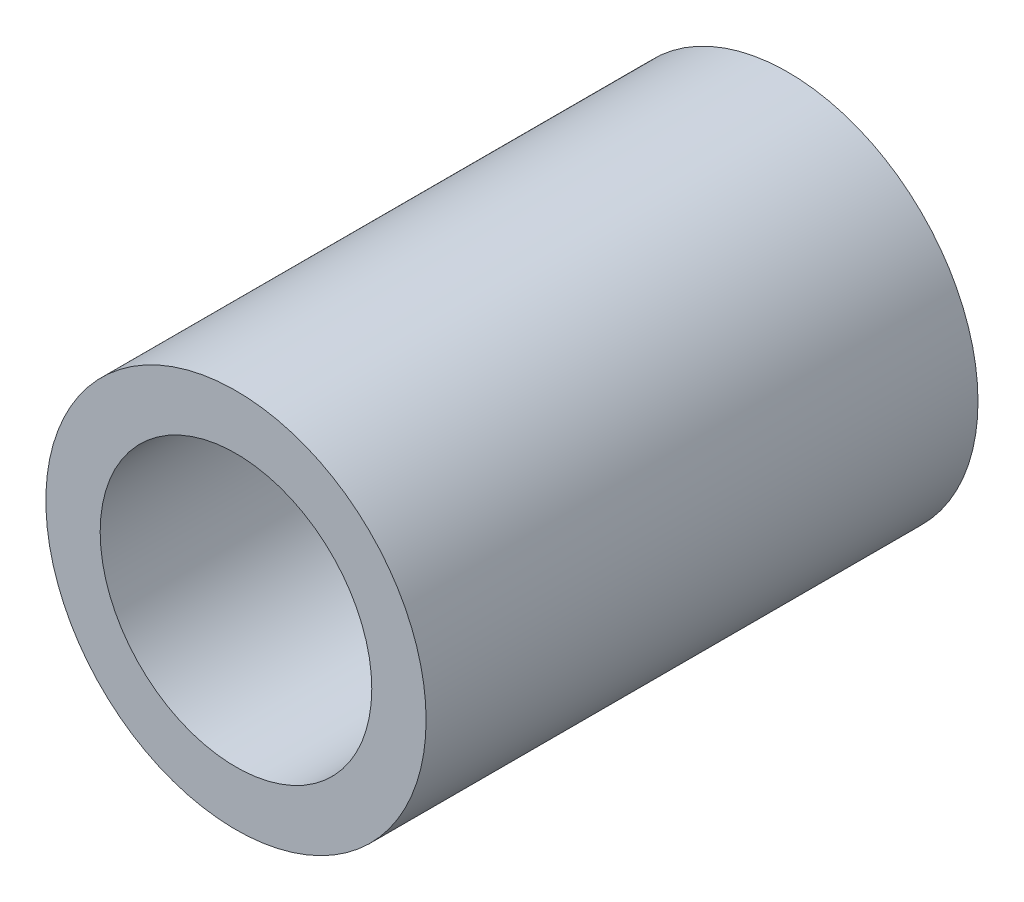
ISO-10303-21;
HEADER;
FILE_DESCRIPTION(('STEP AP214'),'2;1');
FILE_NAME('part.step','',(''),(''),'','','');
FILE_SCHEMA(('AUTOMOTIVE_DESIGN { 1 0 10303 214 1 1 1 1 }'));
ENDSEC;
DATA;
#1=APPLICATION_CONTEXT('core data for automotive mechanical design processes');
#2=APPLICATION_PROTOCOL_DEFINITION('international standard','automotive_design',2000,#1);
#3=PRODUCT_CONTEXT('',#1,'mechanical');
#4=PRODUCT('Part','Part','',(#3));
#5=PRODUCT_RELATED_PRODUCT_CATEGORY('part','',(#4));
#6=PRODUCT_DEFINITION_FORMATION('','',#4);
#7=PRODUCT_DEFINITION_CONTEXT('part definition',#1,'design');
#8=PRODUCT_DEFINITION('design','',#6,#7);
#9=PRODUCT_DEFINITION_SHAPE('','',#8);
#10=(LENGTH_UNIT() NAMED_UNIT(*) SI_UNIT(.MILLI.,.METRE.));
#11=(NAMED_UNIT(*) PLANE_ANGLE_UNIT() SI_UNIT($,.RADIAN.));
#12=(NAMED_UNIT(*) SI_UNIT($,.STERADIAN.) SOLID_ANGLE_UNIT());
#13=UNCERTAINTY_MEASURE_WITH_UNIT(LENGTH_MEASURE(1.E-05),#10,'distance_accuracy_value','');
#14=(GEOMETRIC_REPRESENTATION_CONTEXT(3) GLOBAL_UNCERTAINTY_ASSIGNED_CONTEXT((#13)) GLOBAL_UNIT_ASSIGNED_CONTEXT((#10,
#11,#12)) REPRESENTATION_CONTEXT('',''));
#15=CARTESIAN_POINT('',(0.,0.,0.));
#16=DIRECTION('',(0.,0.,1.));
#17=DIRECTION('',(1.,0.,0.));
#18=AXIS2_PLACEMENT_3D('',#15,#16,#17);
#19=CARTESIAN_POINT('',(0.,0.,50.8));
#20=DIRECTION('',(0.,0.,1.));
#21=DIRECTION('',(1.,0.,0.));
#22=AXIS2_PLACEMENT_3D('',#19,#20,#21);
#23=PLANE('',#22);
#24=CARTESIAN_POINT('',(0.,0.,50.8));
#25=DIRECTION('',(0.,0.,1.));
#26=DIRECTION('',(1.,0.,0.));
#27=AXIS2_PLACEMENT_3D('',#24,#25,#26);
#28=CIRCLE('',#27,17.5);
#29=CARTESIAN_POINT('',(17.5,0.,50.8));
#30=VERTEX_POINT('',#29);
#31=EDGE_CURVE('E12',#30,#30,#28,.T.);
#32=ORIENTED_EDGE('',*,*,#31,.T.);
#33=EDGE_LOOP('',(#32));
#34=FACE_BOUND('',#33,.T.);
#35=CARTESIAN_POINT('',(0.,0.,50.8));
#36=DIRECTION('',(0.,0.,1.));
#37=DIRECTION('',(1.,0.,0.));
#38=AXIS2_PLACEMENT_3D('',#35,#36,#37);
#39=CIRCLE('',#38,12.5);
#40=CARTESIAN_POINT('',(12.5,0.,50.8));
#41=VERTEX_POINT('',#40);
#42=EDGE_CURVE('E52',#41,#41,#39,.T.);
#43=ORIENTED_EDGE('',*,*,#42,.F.);
#44=EDGE_LOOP('',(#43));
#45=FACE_BOUND('',#44,.T.);
#46=ADVANCED_FACE('F41',(#34,#45),#23,.T.);
#47=CARTESIAN_POINT('',(0.,0.,0.));
#48=DIRECTION('',(0.,0.,1.));
#49=DIRECTION('',(1.,0.,0.));
#50=AXIS2_PLACEMENT_3D('',#47,#48,#49);
#51=PLANE('',#50);
#52=CARTESIAN_POINT('',(0.,0.,0.));
#53=DIRECTION('',(0.,0.,1.));
#54=DIRECTION('',(1.,0.,0.));
#55=AXIS2_PLACEMENT_3D('',#52,#53,#54);
#56=CIRCLE('',#55,17.5);
#57=CARTESIAN_POINT('',(17.5,0.,0.));
#58=VERTEX_POINT('',#57);
#59=EDGE_CURVE('E45',#58,#58,#56,.T.);
#60=ORIENTED_EDGE('',*,*,#59,.F.);
#61=EDGE_LOOP('',(#60));
#62=FACE_BOUND('',#61,.T.);
#63=CARTESIAN_POINT('',(0.,0.,0.));
#64=DIRECTION('',(0.,0.,1.));
#65=DIRECTION('',(1.,0.,0.));
#66=AXIS2_PLACEMENT_3D('',#63,#64,#65);
#67=CIRCLE('',#66,12.5);
#68=CARTESIAN_POINT('',(12.5,0.,0.));
#69=VERTEX_POINT('',#68);
#70=EDGE_CURVE('E54',#69,#69,#67,.T.);
#71=ORIENTED_EDGE('',*,*,#70,.T.);
#72=EDGE_LOOP('',(#71));
#73=FACE_BOUND('',#72,.T.);
#74=ADVANCED_FACE('F64',(#62,#73),#51,.F.);
#75=CARTESIAN_POINT('',(0.,0.,50.8));
#76=DIRECTION('',(0.,0.,-1.));
#77=DIRECTION('',(-1.,0.,0.));
#78=AXIS2_PLACEMENT_3D('',#75,#76,#77);
#79=CYLINDRICAL_SURFACE('',#78,17.5);
#80=ORIENTED_EDGE('',*,*,#31,.F.);
#81=EDGE_LOOP('',(#80));
#82=FACE_BOUND('',#81,.T.);
#83=ORIENTED_EDGE('',*,*,#59,.T.);
#84=EDGE_LOOP('',(#83));
#85=FACE_BOUND('',#84,.T.);
#86=ADVANCED_FACE('F43',(#82,#85),#79,.T.);
#87=CARTESIAN_POINT('',(0.,0.,50.8));
#88=DIRECTION('',(0.,0.,-1.));
#89=DIRECTION('',(-1.,0.,0.));
#90=AXIS2_PLACEMENT_3D('',#87,#88,#89);
#91=CYLINDRICAL_SURFACE('',#90,12.5);
#92=ORIENTED_EDGE('',*,*,#42,.T.);
#93=EDGE_LOOP('',(#92));
#94=FACE_BOUND('',#93,.T.);
#95=ORIENTED_EDGE('',*,*,#70,.F.);
#96=EDGE_LOOP('',(#95));
#97=FACE_BOUND('',#96,.T.);
#98=ADVANCED_FACE('F60',(#94,#97),#91,.F.);
#99=CLOSED_SHELL('',(#46,#74,#86,#98));
#100=MANIFOLD_SOLID_BREP('B2',#99);
#101=ADVANCED_BREP_SHAPE_REPRESENTATION('',(#18,#100),#14);
#102=SHAPE_DEFINITION_REPRESENTATION(#9,#101);
ENDSEC;
END-ISO-10303-21;
